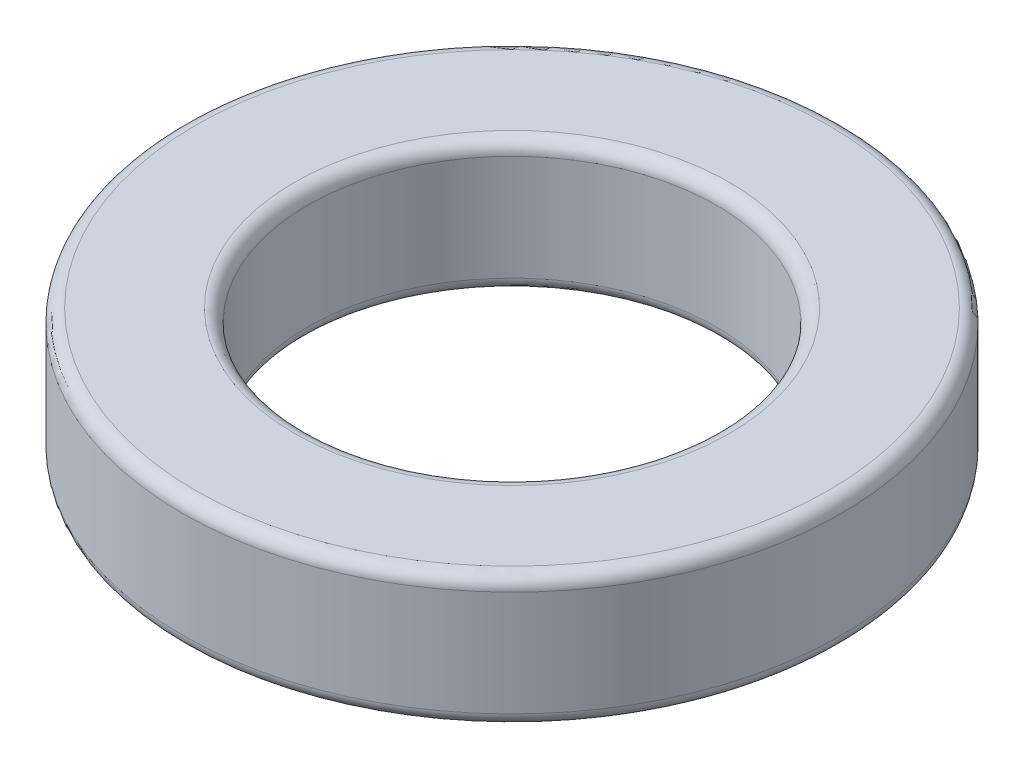
ISO-10303-21;
HEADER;
FILE_DESCRIPTION(('STEP AP214'),'2;1');
FILE_NAME('part.step','',(''),(''),'','','');
FILE_SCHEMA(('AUTOMOTIVE_DESIGN { 1 0 10303 214 1 1 1 1 }'));
ENDSEC;
DATA;
#1=APPLICATION_CONTEXT('core data for automotive mechanical design processes');
#2=APPLICATION_PROTOCOL_DEFINITION('international standard','automotive_design',2000,#1);
#3=PRODUCT_CONTEXT('',#1,'mechanical');
#4=PRODUCT('Part','Part','',(#3));
#5=PRODUCT_RELATED_PRODUCT_CATEGORY('part','',(#4));
#6=PRODUCT_DEFINITION_FORMATION('','',#4);
#7=PRODUCT_DEFINITION_CONTEXT('part definition',#1,'design');
#8=PRODUCT_DEFINITION('design','',#6,#7);
#9=PRODUCT_DEFINITION_SHAPE('','',#8);
#10=(LENGTH_UNIT() NAMED_UNIT(*) SI_UNIT(.MILLI.,.METRE.));
#11=(NAMED_UNIT(*) PLANE_ANGLE_UNIT() SI_UNIT($,.RADIAN.));
#12=(NAMED_UNIT(*) SI_UNIT($,.STERADIAN.) SOLID_ANGLE_UNIT());
#13=UNCERTAINTY_MEASURE_WITH_UNIT(LENGTH_MEASURE(1.E-05),#10,'distance_accuracy_value','');
#14=(GEOMETRIC_REPRESENTATION_CONTEXT(3) GLOBAL_UNCERTAINTY_ASSIGNED_CONTEXT((#13)) GLOBAL_UNIT_ASSIGNED_CONTEXT((#10,
#11,#12)) REPRESENTATION_CONTEXT('',''));
#15=CARTESIAN_POINT('',(0.,0.,0.));
#16=DIRECTION('',(0.,0.,1.));
#17=DIRECTION('',(1.,0.,0.));
#18=AXIS2_PLACEMENT_3D('',#15,#16,#17);
#19=CARTESIAN_POINT('',(0.,1.,0.));
#20=DIRECTION('',(0.,1.,0.));
#21=DIRECTION('',(0.,0.,1.));
#22=AXIS2_PLACEMENT_3D('',#19,#20,#21);
#23=PLANE('',#22);
#24=CARTESIAN_POINT('',(0.,1.,0.));
#25=DIRECTION('',(0.,1.,0.));
#26=DIRECTION('',(0.,0.,1.));
#27=AXIS2_PLACEMENT_3D('',#24,#25,#26);
#28=CIRCLE('',#27,2.4);
#29=CARTESIAN_POINT('',(0.,1.,2.4));
#30=VERTEX_POINT('',#29);
#31=EDGE_CURVE('E10',#30,#30,#28,.T.);
#32=ORIENTED_EDGE('',*,*,#31,.T.);
#33=EDGE_LOOP('',(#32));
#34=FACE_BOUND('',#33,.T.);
#35=CARTESIAN_POINT('',(0.,1.,0.));
#36=DIRECTION('',(0.,1.,0.));
#37=DIRECTION('',(0.,0.,1.));
#38=AXIS2_PLACEMENT_3D('',#35,#36,#37);
#39=CIRCLE('',#38,1.65);
#40=CARTESIAN_POINT('',(0.,1.,1.65));
#41=VERTEX_POINT('',#40);
#42=EDGE_CURVE('E44',#41,#41,#39,.F.);
#43=ORIENTED_EDGE('',*,*,#42,.T.);
#44=EDGE_LOOP('',(#43));
#45=FACE_BOUND('',#44,.T.);
#46=ADVANCED_FACE('F37',(#34,#45),#23,.T.);
#47=CARTESIAN_POINT('',(0.,0.,0.));
#48=DIRECTION('',(0.,1.,0.));
#49=DIRECTION('',(0.,0.,1.));
#50=AXIS2_PLACEMENT_3D('',#47,#48,#49);
#51=PLANE('',#50);
#52=CARTESIAN_POINT('',(0.,0.,0.));
#53=DIRECTION('',(0.,1.,0.));
#54=DIRECTION('',(0.,0.,1.));
#55=AXIS2_PLACEMENT_3D('',#52,#53,#54);
#56=CIRCLE('',#55,1.65);
#57=CARTESIAN_POINT('',(0.,0.,1.65));
#58=VERTEX_POINT('',#57);
#59=EDGE_CURVE('E63',#58,#58,#56,.T.);
#60=ORIENTED_EDGE('',*,*,#59,.T.);
#61=EDGE_LOOP('',(#60));
#62=FACE_BOUND('',#61,.T.);
#63=CARTESIAN_POINT('',(0.,0.,0.));
#64=DIRECTION('',(0.,1.,0.));
#65=DIRECTION('',(0.,0.,1.));
#66=AXIS2_PLACEMENT_3D('',#63,#64,#65);
#67=CIRCLE('',#66,2.4);
#68=CARTESIAN_POINT('',(0.,0.,2.4));
#69=VERTEX_POINT('',#68);
#70=EDGE_CURVE('E66',#69,#69,#67,.F.);
#71=ORIENTED_EDGE('',*,*,#70,.T.);
#72=EDGE_LOOP('',(#71));
#73=FACE_BOUND('',#72,.T.);
#74=ADVANCED_FACE('F70',(#62,#73),#51,.F.);
#75=CARTESIAN_POINT('',(0.,1.,0.));
#76=DIRECTION('',(0.,-1.,0.));
#77=DIRECTION('',(0.,0.,-1.));
#78=AXIS2_PLACEMENT_3D('',#75,#76,#77);
#79=CYLINDRICAL_SURFACE('',#78,2.5);
#80=CARTESIAN_POINT('',(0.,0.1,0.));
#81=DIRECTION('',(0.,1.,0.));
#82=DIRECTION('',(0.,0.,1.));
#83=AXIS2_PLACEMENT_3D('',#80,#81,#82);
#84=CIRCLE('',#83,2.5);
#85=CARTESIAN_POINT('',(0.,0.1,2.5));
#86=VERTEX_POINT('',#85);
#87=EDGE_CURVE('E48',#86,#86,#84,.T.);
#88=ORIENTED_EDGE('',*,*,#87,.T.);
#89=EDGE_LOOP('',(#88));
#90=FACE_BOUND('',#89,.T.);
#91=CARTESIAN_POINT('',(0.,0.9,0.));
#92=DIRECTION('',(0.,1.,0.));
#93=DIRECTION('',(0.,0.,1.));
#94=AXIS2_PLACEMENT_3D('',#91,#92,#93);
#95=CIRCLE('',#94,2.5);
#96=CARTESIAN_POINT('',(0.,0.9,2.5));
#97=VERTEX_POINT('',#96);
#98=EDGE_CURVE('E52',#97,#97,#95,.F.);
#99=ORIENTED_EDGE('',*,*,#98,.T.);
#100=EDGE_LOOP('',(#99));
#101=FACE_BOUND('',#100,.T.);
#102=ADVANCED_FACE('F80',(#90,#101),#79,.T.);
#103=CARTESIAN_POINT('',(0.,1.,0.));
#104=DIRECTION('',(0.,-1.,0.));
#105=DIRECTION('',(0.,0.,-1.));
#106=AXIS2_PLACEMENT_3D('',#103,#104,#105);
#107=CYLINDRICAL_SURFACE('',#106,1.55);
#108=CARTESIAN_POINT('',(0.,0.1,0.));
#109=DIRECTION('',(0.,1.,0.));
#110=DIRECTION('',(0.,0.,1.));
#111=AXIS2_PLACEMENT_3D('',#108,#109,#110);
#112=CIRCLE('',#111,1.55);
#113=CARTESIAN_POINT('',(0.,0.1,1.55));
#114=VERTEX_POINT('',#113);
#115=EDGE_CURVE('E57',#114,#114,#112,.F.);
#116=ORIENTED_EDGE('',*,*,#115,.T.);
#117=EDGE_LOOP('',(#116));
#118=FACE_BOUND('',#117,.T.);
#119=CARTESIAN_POINT('',(0.,0.9,0.));
#120=DIRECTION('',(0.,1.,0.));
#121=DIRECTION('',(0.,0.,1.));
#122=AXIS2_PLACEMENT_3D('',#119,#120,#121);
#123=CIRCLE('',#122,1.55);
#124=CARTESIAN_POINT('',(0.,0.9,1.55));
#125=VERTEX_POINT('',#124);
#126=EDGE_CURVE('E60',#125,#125,#123,.T.);
#127=ORIENTED_EDGE('',*,*,#126,.T.);
#128=EDGE_LOOP('',(#127));
#129=FACE_BOUND('',#128,.T.);
#130=ADVANCED_FACE('F83',(#118,#129),#107,.F.);
#131=CARTESIAN_POINT('',(0.,0.1,0.));
#132=DIRECTION('',(0.,1.,0.));
#133=DIRECTION('',(0.,0.,1.));
#134=AXIS2_PLACEMENT_3D('',#131,#132,#133);
#135=TOROIDAL_SURFACE('',#134,1.65,0.1);
#136=ORIENTED_EDGE('',*,*,#115,.F.);
#137=EDGE_LOOP('',(#136));
#138=FACE_BOUND('',#137,.T.);
#139=ORIENTED_EDGE('',*,*,#59,.F.);
#140=EDGE_LOOP('',(#139));
#141=FACE_BOUND('',#140,.T.);
#142=ADVANCED_FACE('F76',(#138,#141),#135,.T.);
#143=CARTESIAN_POINT('',(0.,0.1,0.));
#144=DIRECTION('',(0.,1.,0.));
#145=DIRECTION('',(0.,0.,1.));
#146=AXIS2_PLACEMENT_3D('',#143,#144,#145);
#147=TOROIDAL_SURFACE('',#146,2.4,0.1);
#148=ORIENTED_EDGE('',*,*,#70,.F.);
#149=EDGE_LOOP('',(#148));
#150=FACE_BOUND('',#149,.T.);
#151=ORIENTED_EDGE('',*,*,#87,.F.);
#152=EDGE_LOOP('',(#151));
#153=FACE_BOUND('',#152,.T.);
#154=ADVANCED_FACE('F72',(#150,#153),#147,.T.);
#155=CARTESIAN_POINT('',(0.,0.9,0.));
#156=DIRECTION('',(0.,1.,0.));
#157=DIRECTION('',(0.,0.,1.));
#158=AXIS2_PLACEMENT_3D('',#155,#156,#157);
#159=TOROIDAL_SURFACE('',#158,2.4,0.1);
#160=ORIENTED_EDGE('',*,*,#98,.F.);
#161=EDGE_LOOP('',(#160));
#162=FACE_BOUND('',#161,.T.);
#163=ORIENTED_EDGE('',*,*,#31,.F.);
#164=EDGE_LOOP('',(#163));
#165=FACE_BOUND('',#164,.T.);
#166=ADVANCED_FACE('F75',(#162,#165),#159,.T.);
#167=CARTESIAN_POINT('',(0.,0.9,0.));
#168=DIRECTION('',(0.,1.,0.));
#169=DIRECTION('',(0.,0.,1.));
#170=AXIS2_PLACEMENT_3D('',#167,#168,#169);
#171=TOROIDAL_SURFACE('',#170,1.65,0.1);
#172=ORIENTED_EDGE('',*,*,#42,.F.);
#173=EDGE_LOOP('',(#172));
#174=FACE_BOUND('',#173,.T.);
#175=ORIENTED_EDGE('',*,*,#126,.F.);
#176=EDGE_LOOP('',(#175));
#177=FACE_BOUND('',#176,.T.);
#178=ADVANCED_FACE('F39',(#174,#177),#171,.T.);
#179=CLOSED_SHELL('',(#46,#74,#102,#130,#142,#154,#166,#178));
#180=MANIFOLD_SOLID_BREP('B2',#179);
#181=ADVANCED_BREP_SHAPE_REPRESENTATION('',(#18,#180),#14);
#182=SHAPE_DEFINITION_REPRESENTATION(#9,#181);
ENDSEC;
END-ISO-10303-21;
